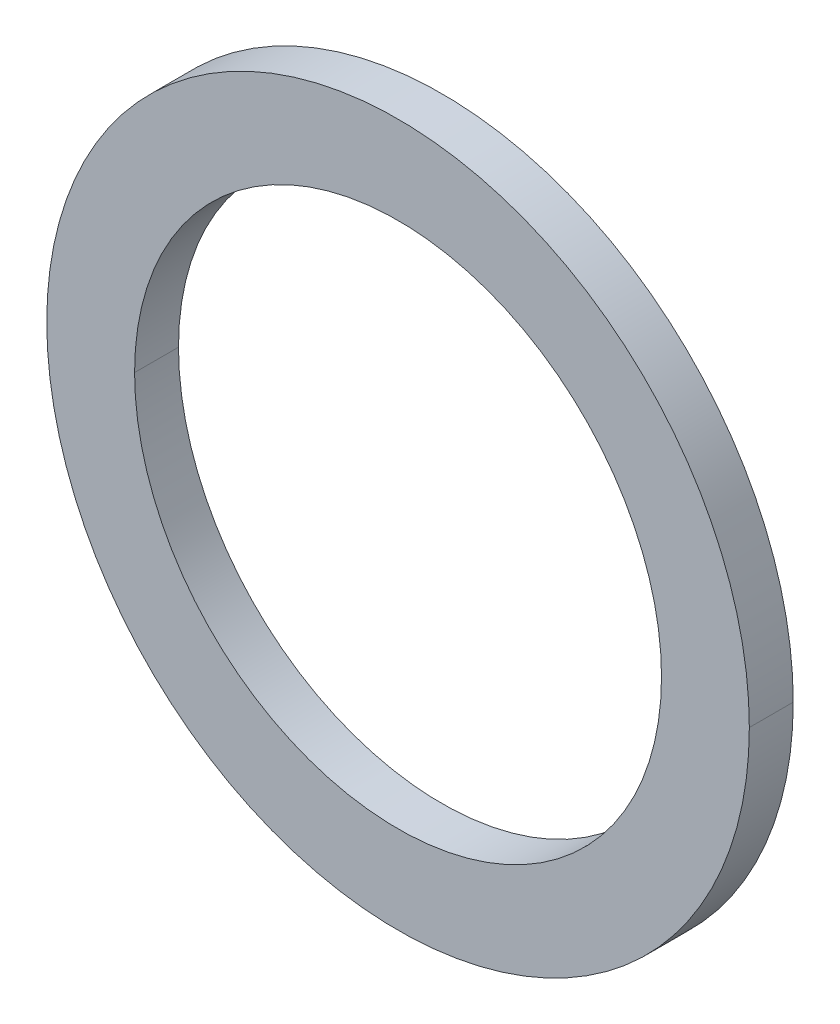
ISO-10303-21;
HEADER;
FILE_DESCRIPTION(('STEP AP214'),'2;1');
FILE_NAME('part.step','',(''),(''),'','','');
FILE_SCHEMA(('AUTOMOTIVE_DESIGN { 1 0 10303 214 1 1 1 1 }'));
ENDSEC;
DATA;
#1=APPLICATION_CONTEXT('core data for automotive mechanical design processes');
#2=APPLICATION_PROTOCOL_DEFINITION('international standard','automotive_design',2000,#1);
#3=PRODUCT_CONTEXT('',#1,'mechanical');
#4=PRODUCT('Part','Part','',(#3));
#5=PRODUCT_RELATED_PRODUCT_CATEGORY('part','',(#4));
#6=PRODUCT_DEFINITION_FORMATION('','',#4);
#7=PRODUCT_DEFINITION_CONTEXT('part definition',#1,'design');
#8=PRODUCT_DEFINITION('design','',#6,#7);
#9=PRODUCT_DEFINITION_SHAPE('','',#8);
#10=(LENGTH_UNIT() NAMED_UNIT(*) SI_UNIT(.MILLI.,.METRE.));
#11=(NAMED_UNIT(*) PLANE_ANGLE_UNIT() SI_UNIT($,.RADIAN.));
#12=(NAMED_UNIT(*) SI_UNIT($,.STERADIAN.) SOLID_ANGLE_UNIT());
#13=UNCERTAINTY_MEASURE_WITH_UNIT(LENGTH_MEASURE(1.E-05),#10,'distance_accuracy_value','');
#14=(GEOMETRIC_REPRESENTATION_CONTEXT(3) GLOBAL_UNCERTAINTY_ASSIGNED_CONTEXT((#13)) GLOBAL_UNIT_ASSIGNED_CONTEXT((#10,
#11,#12)) REPRESENTATION_CONTEXT('',''));
#15=CARTESIAN_POINT('',(0.,0.,0.));
#16=DIRECTION('',(0.,0.,1.));
#17=DIRECTION('',(1.,0.,0.));
#18=AXIS2_PLACEMENT_3D('',#15,#16,#17);
#19=CARTESIAN_POINT('',(3.700838201676,-8.700838201676,9.800028197172));
#20=DIRECTION('',(0.,0.,-1.));
#21=DIRECTION('',(-1.,0.,0.));
#22=AXIS2_PLACEMENT_3D('',#19,#20,#21);
#23=CYLINDRICAL_SURFACE('',#22,0.6);
#24=DIRECTION('',(0.,0.,-1.));
#25=VECTOR('',#24,1.);
#26=CARTESIAN_POINT('',(4.300838201676,-8.700838201676,9.800028197172));
#27=LINE('',#26,#25);
#28=CARTESIAN_POINT('',(4.300838201676,-8.700838201676,9.800028197172));
#29=VERTEX_POINT('',#28);
#30=CARTESIAN_POINT('',(4.300838201676,-8.700838201676,9.700028197172));
#31=VERTEX_POINT('',#30);
#32=EDGE_CURVE('E11',#29,#31,#27,.T.);
#33=ORIENTED_EDGE('',*,*,#32,.F.);
#34=CARTESIAN_POINT('',(3.700838201676,-8.700838201676,9.800028197172));
#35=DIRECTION('',(0.,0.,1.));
#36=DIRECTION('',(1.,0.,0.));
#37=AXIS2_PLACEMENT_3D('',#34,#35,#36);
#38=CIRCLE('',#37,0.6);
#39=CARTESIAN_POINT('',(3.100838201676,-8.700838201676,9.800028197172));
#40=VERTEX_POINT('',#39);
#41=EDGE_CURVE('E25',#29,#40,#38,.T.);
#42=ORIENTED_EDGE('',*,*,#41,.T.);
#43=DIRECTION('',(0.,0.,-1.));
#44=VECTOR('',#43,1.);
#45=CARTESIAN_POINT('',(3.100838201676,-8.700838201676,9.800028197172));
#46=LINE('',#45,#44);
#47=CARTESIAN_POINT('',(3.100838201676,-8.700838201676,9.700028197172));
#48=VERTEX_POINT('',#47);
#49=EDGE_CURVE('E110',#40,#48,#46,.T.);
#50=ORIENTED_EDGE('',*,*,#49,.T.);
#51=CARTESIAN_POINT('',(3.700838201676,-8.700838201676,9.700028197172));
#52=DIRECTION('',(0.,0.,1.));
#53=DIRECTION('',(1.,0.,0.));
#54=AXIS2_PLACEMENT_3D('',#51,#52,#53);
#55=CIRCLE('',#54,0.6);
#56=EDGE_CURVE('E106',#31,#48,#55,.T.);
#57=ORIENTED_EDGE('',*,*,#56,.F.);
#58=EDGE_LOOP('',(#33,#42,#50,#57));
#59=FACE_BOUND('',#58,.T.);
#60=ADVANCED_FACE('F17',(#59),#23,.F.);
#61=CARTESIAN_POINT('',(3.700838201676,-8.700838201676,9.800028197172));
#62=DIRECTION('',(0.,0.,-1.));
#63=DIRECTION('',(-1.,0.,0.));
#64=AXIS2_PLACEMENT_3D('',#61,#62,#63);
#65=CYLINDRICAL_SURFACE('',#64,0.8);
#66=DIRECTION('',(0.,0.,-1.));
#67=VECTOR('',#66,1.);
#68=CARTESIAN_POINT('',(4.500838201676,-8.700838201676,9.800028197172));
#69=LINE('',#68,#67);
#70=CARTESIAN_POINT('',(4.500838201676,-8.700838201676,9.800028197172));
#71=VERTEX_POINT('',#70);
#72=CARTESIAN_POINT('',(4.500838201676,-8.700838201676,9.700028197172));
#73=VERTEX_POINT('',#72);
#74=EDGE_CURVE('E89',#71,#73,#69,.T.);
#75=ORIENTED_EDGE('',*,*,#74,.F.);
#76=CARTESIAN_POINT('',(3.700838201676,-8.700838201676,9.800028197172));
#77=DIRECTION('',(0.,0.,1.));
#78=DIRECTION('',(1.,0.,0.));
#79=AXIS2_PLACEMENT_3D('',#76,#77,#78);
#80=CIRCLE('',#79,0.8);
#81=CARTESIAN_POINT('',(2.900838201676,-8.700838201676,9.800028197172));
#82=VERTEX_POINT('',#81);
#83=EDGE_CURVE('E76',#82,#71,#80,.T.);
#84=ORIENTED_EDGE('',*,*,#83,.F.);
#85=DIRECTION('',(0.,0.,-1.));
#86=VECTOR('',#85,1.);
#87=CARTESIAN_POINT('',(2.900838201676,-8.700838201676,9.800028197172));
#88=LINE('',#87,#86);
#89=CARTESIAN_POINT('',(2.900838201676,-8.700838201676,9.700028197172));
#90=VERTEX_POINT('',#89);
#91=EDGE_CURVE('E70',#82,#90,#88,.T.);
#92=ORIENTED_EDGE('',*,*,#91,.T.);
#93=CARTESIAN_POINT('',(3.700838201676,-8.700838201676,9.700028197172));
#94=DIRECTION('',(0.,0.,1.));
#95=DIRECTION('',(1.,0.,0.));
#96=AXIS2_PLACEMENT_3D('',#93,#94,#95);
#97=CIRCLE('',#96,0.8);
#98=EDGE_CURVE('E73',#90,#73,#97,.T.);
#99=ORIENTED_EDGE('',*,*,#98,.T.);
#100=EDGE_LOOP('',(#75,#84,#92,#99));
#101=FACE_BOUND('',#100,.T.);
#102=ADVANCED_FACE('F72',(#101),#65,.T.);
#103=CARTESIAN_POINT('',(3.700838201676,-8.700838201676,9.700028197172));
#104=DIRECTION('',(0.,0.,1.));
#105=DIRECTION('',(1.,0.,0.));
#106=AXIS2_PLACEMENT_3D('',#103,#104,#105);
#107=PLANE('',#106);
#108=CARTESIAN_POINT('',(3.700838201676,-8.700838201676,9.700028197172));
#109=DIRECTION('',(0.,0.,1.));
#110=DIRECTION('',(1.,0.,0.));
#111=AXIS2_PLACEMENT_3D('',#108,#109,#110);
#112=CIRCLE('',#111,0.6);
#113=EDGE_CURVE('E86',#48,#31,#112,.T.);
#114=ORIENTED_EDGE('',*,*,#113,.T.);
#115=ORIENTED_EDGE('',*,*,#56,.T.);
#116=EDGE_LOOP('',(#114,#115));
#117=FACE_BOUND('',#116,.T.);
#118=ORIENTED_EDGE('',*,*,#98,.F.);
#119=CARTESIAN_POINT('',(3.700838201676,-8.700838201676,9.700028197172));
#120=DIRECTION('',(0.,0.,1.));
#121=DIRECTION('',(1.,0.,0.));
#122=AXIS2_PLACEMENT_3D('',#119,#120,#121);
#123=CIRCLE('',#122,0.8);
#124=EDGE_CURVE('E84',#73,#90,#123,.T.);
#125=ORIENTED_EDGE('',*,*,#124,.F.);
#126=EDGE_LOOP('',(#118,#125));
#127=FACE_BOUND('',#126,.T.);
#128=ADVANCED_FACE('F83',(#117,#127),#107,.F.);
#129=CARTESIAN_POINT('',(3.700838201676,-8.700838201676,9.800028197172));
#130=DIRECTION('',(0.,0.,1.));
#131=DIRECTION('',(1.,0.,0.));
#132=AXIS2_PLACEMENT_3D('',#129,#130,#131);
#133=PLANE('',#132);
#134=CARTESIAN_POINT('',(3.700838201676,-8.700838201676,9.800028197172));
#135=DIRECTION('',(0.,0.,1.));
#136=DIRECTION('',(1.,0.,0.));
#137=AXIS2_PLACEMENT_3D('',#134,#135,#136);
#138=CIRCLE('',#137,0.6);
#139=EDGE_CURVE('E91',#40,#29,#138,.T.);
#140=ORIENTED_EDGE('',*,*,#139,.F.);
#141=ORIENTED_EDGE('',*,*,#41,.F.);
#142=EDGE_LOOP('',(#140,#141));
#143=FACE_BOUND('',#142,.T.);
#144=ORIENTED_EDGE('',*,*,#83,.T.);
#145=CARTESIAN_POINT('',(3.700838201676,-8.700838201676,9.800028197172));
#146=DIRECTION('',(0.,0.,1.));
#147=DIRECTION('',(1.,0.,0.));
#148=AXIS2_PLACEMENT_3D('',#145,#146,#147);
#149=CIRCLE('',#148,0.8);
#150=EDGE_CURVE('E99',#71,#82,#149,.T.);
#151=ORIENTED_EDGE('',*,*,#150,.T.);
#152=EDGE_LOOP('',(#144,#151));
#153=FACE_BOUND('',#152,.T.);
#154=ADVANCED_FACE('F118',(#143,#153),#133,.T.);
#155=CARTESIAN_POINT('',(3.700838201676,-8.700838201676,9.800028197172));
#156=DIRECTION('',(0.,0.,-1.));
#157=DIRECTION('',(-1.,0.,0.));
#158=AXIS2_PLACEMENT_3D('',#155,#156,#157);
#159=CYLINDRICAL_SURFACE('',#158,0.8);
#160=ORIENTED_EDGE('',*,*,#150,.F.);
#161=ORIENTED_EDGE('',*,*,#74,.T.);
#162=ORIENTED_EDGE('',*,*,#124,.T.);
#163=ORIENTED_EDGE('',*,*,#91,.F.);
#164=EDGE_LOOP('',(#160,#161,#162,#163));
#165=FACE_BOUND('',#164,.T.);
#166=ADVANCED_FACE('F88',(#165),#159,.T.);
#167=CARTESIAN_POINT('',(3.700838201676,-8.700838201676,9.800028197172));
#168=DIRECTION('',(0.,0.,-1.));
#169=DIRECTION('',(-1.,0.,0.));
#170=AXIS2_PLACEMENT_3D('',#167,#168,#169);
#171=CYLINDRICAL_SURFACE('',#170,0.6);
#172=ORIENTED_EDGE('',*,*,#139,.T.);
#173=ORIENTED_EDGE('',*,*,#32,.T.);
#174=ORIENTED_EDGE('',*,*,#113,.F.);
#175=ORIENTED_EDGE('',*,*,#49,.F.);
#176=EDGE_LOOP('',(#172,#173,#174,#175));
#177=FACE_BOUND('',#176,.T.);
#178=ADVANCED_FACE('F117',(#177),#171,.F.);
#179=CLOSED_SHELL('',(#60,#102,#128,#154,#166,#178));
#180=MANIFOLD_SOLID_BREP('B1',#179);
#181=ADVANCED_BREP_SHAPE_REPRESENTATION('',(#18,#180),#14);
#182=SHAPE_DEFINITION_REPRESENTATION(#9,#181);
ENDSEC;
END-ISO-10303-21;
